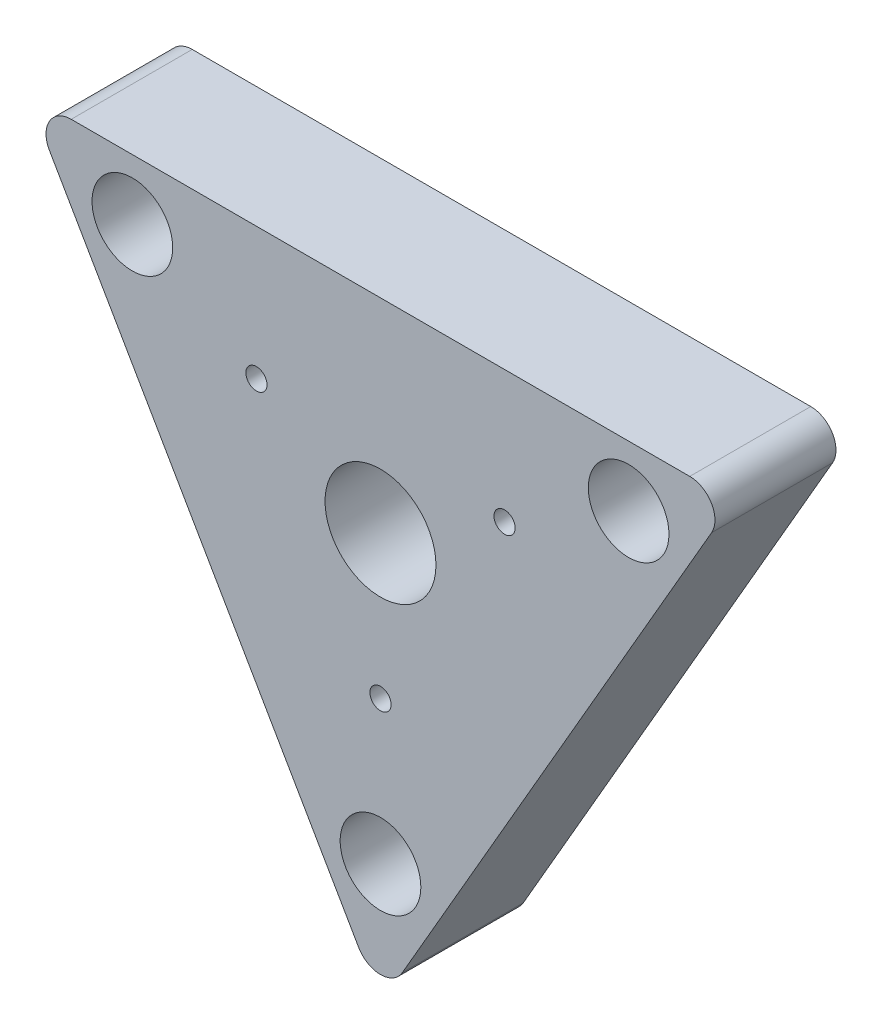
ISO-10303-21;
HEADER;
FILE_DESCRIPTION(('STEP AP214'),'2;1');
FILE_NAME('part.step','',(''),(''),'','','');
FILE_SCHEMA(('AUTOMOTIVE_DESIGN { 1 0 10303 214 1 1 1 1 }'));
ENDSEC;
DATA;
#1=APPLICATION_CONTEXT('core data for automotive mechanical design processes');
#2=APPLICATION_PROTOCOL_DEFINITION('international standard','automotive_design',2000,#1);
#3=PRODUCT_CONTEXT('',#1,'mechanical');
#4=PRODUCT('Part','Part','',(#3));
#5=PRODUCT_RELATED_PRODUCT_CATEGORY('part','',(#4));
#6=PRODUCT_DEFINITION_FORMATION('','',#4);
#7=PRODUCT_DEFINITION_CONTEXT('part definition',#1,'design');
#8=PRODUCT_DEFINITION('design','',#6,#7);
#9=PRODUCT_DEFINITION_SHAPE('','',#8);
#10=(LENGTH_UNIT() NAMED_UNIT(*) SI_UNIT(.MILLI.,.METRE.));
#11=(NAMED_UNIT(*) PLANE_ANGLE_UNIT() SI_UNIT($,.RADIAN.));
#12=(NAMED_UNIT(*) SI_UNIT($,.STERADIAN.) SOLID_ANGLE_UNIT());
#13=UNCERTAINTY_MEASURE_WITH_UNIT(LENGTH_MEASURE(1.E-05),#10,'distance_accuracy_value','');
#14=(GEOMETRIC_REPRESENTATION_CONTEXT(3) GLOBAL_UNCERTAINTY_ASSIGNED_CONTEXT((#13)) GLOBAL_UNIT_ASSIGNED_CONTEXT((#10,
#11,#12)) REPRESENTATION_CONTEXT('',''));
#15=CARTESIAN_POINT('',(0.,0.,0.));
#16=DIRECTION('',(0.,0.,1.));
#17=DIRECTION('',(1.,0.,0.));
#18=AXIS2_PLACEMENT_3D('',#15,#16,#17);
#19=CARTESIAN_POINT('',(43.123778273753,-24.897524994825,24.));
#20=DIRECTION('',(0.866025403784438,-0.5,0.));
#21=DIRECTION('',(0.5,0.866025403784439,0.));
#22=AXIS2_PLACEMENT_3D('',#19,#20,#21);
#23=PLANE('',#22);
#24=DIRECTION('',(-0.5,-0.866025403784439,0.));
#25=VECTOR('',#24,1.);
#26=CARTESIAN_POINT('',(43.123778273753,-24.897524994825,0.));
#27=LINE('',#26,#25);
#28=CARTESIAN_POINT('',(74.0551568549426,28.6771942559431,0.));
#29=VERTEX_POINT('',#28);
#30=CARTESIAN_POINT('',(12.7154108927871,-77.5663622738782,0.));
#31=VERTEX_POINT('',#30);
#32=EDGE_CURVE('E130',#29,#31,#27,.T.);
#33=ORIENTED_EDGE('',*,*,#32,.F.);
#34=DIRECTION('',(0.,0.,-1.));
#35=VECTOR('',#34,1.);
#36=CARTESIAN_POINT('',(74.0551568549426,28.6771942559431,24.));
#37=LINE('',#36,#35);
#38=CARTESIAN_POINT('',(74.0551568549426,28.6771942559431,24.));
#39=VERTEX_POINT('',#38);
#40=EDGE_CURVE('E11',#39,#29,#37,.T.);
#41=ORIENTED_EDGE('',*,*,#40,.F.);
#42=DIRECTION('',(-0.5,-0.866025403784439,0.));
#43=VECTOR('',#42,1.);
#44=CARTESIAN_POINT('',(43.123778273753,-24.897524994825,24.));
#45=LINE('',#44,#43);
#46=CARTESIAN_POINT('',(12.7154108927871,-77.5663622738782,24.));
#47=VERTEX_POINT('',#46);
#48=EDGE_CURVE('E245',#39,#47,#45,.T.);
#49=ORIENTED_EDGE('',*,*,#48,.T.);
#50=DIRECTION('',(0.,0.,-1.));
#51=VECTOR('',#50,1.);
#52=CARTESIAN_POINT('',(12.7154108927871,-77.5663622738782,24.));
#53=LINE('',#52,#51);
#54=EDGE_CURVE('E52',#47,#31,#53,.T.);
#55=ORIENTED_EDGE('',*,*,#54,.T.);
#56=EDGE_LOOP('',(#33,#41,#49,#55));
#57=FACE_BOUND('',#56,.T.);
#58=ADVANCED_FACE('F35',(#57),#23,.T.);
#59=CARTESIAN_POINT('',(69.7250298360205,31.1771942559432,24.));
#60=DIRECTION('',(0.,0.,-1.));
#61=DIRECTION('',(-1.,0.,0.));
#62=AXIS2_PLACEMENT_3D('',#59,#60,#61);
#63=CYLINDRICAL_SURFACE('',#62,5.);
#64=CARTESIAN_POINT('',(69.7250298360205,31.1771942559432,0.));
#65=DIRECTION('',(0.,0.,1.));
#66=DIRECTION('',(1.,0.,0.));
#67=AXIS2_PLACEMENT_3D('',#64,#65,#66);
#68=CIRCLE('',#67,5.);
#69=CARTESIAN_POINT('',(69.7250298360204,36.1771942559432,0.));
#70=VERTEX_POINT('',#69);
#71=EDGE_CURVE('E133',#70,#29,#68,.F.);
#72=ORIENTED_EDGE('',*,*,#71,.F.);
#73=DIRECTION('',(0.,0.,-1.));
#74=VECTOR('',#73,1.);
#75=CARTESIAN_POINT('',(69.7250298360204,36.1771942559432,24.));
#76=LINE('',#75,#74);
#77=CARTESIAN_POINT('',(69.7250298360204,36.1771942559432,24.));
#78=VERTEX_POINT('',#77);
#79=EDGE_CURVE('E44',#78,#70,#76,.T.);
#80=ORIENTED_EDGE('',*,*,#79,.F.);
#81=CARTESIAN_POINT('',(69.7250298360205,31.1771942559432,24.));
#82=DIRECTION('',(0.,0.,1.));
#83=DIRECTION('',(1.,0.,0.));
#84=AXIS2_PLACEMENT_3D('',#81,#82,#83);
#85=CIRCLE('',#84,5.);
#86=EDGE_CURVE('E247',#78,#39,#85,.F.);
#87=ORIENTED_EDGE('',*,*,#86,.T.);
#88=ORIENTED_EDGE('',*,*,#40,.T.);
#89=EDGE_LOOP('',(#72,#80,#87,#88));
#90=FACE_BOUND('',#89,.T.);
#91=ADVANCED_FACE('F163',(#90),#63,.T.);
#92=CARTESIAN_POINT('',(0.,36.1771942559432,24.));
#93=DIRECTION('',(0.,1.,0.));
#94=DIRECTION('',(0.,0.,1.));
#95=AXIS2_PLACEMENT_3D('',#92,#93,#94);
#96=PLANE('',#95);
#97=DIRECTION('',(1.,0.,0.));
#98=VECTOR('',#97,1.);
#99=CARTESIAN_POINT('',(0.,36.1771942559432,0.));
#100=LINE('',#99,#98);
#101=CARTESIAN_POINT('',(-52.9544620882907,36.1771942559432,0.));
#102=VERTEX_POINT('',#101);
#103=EDGE_CURVE('E136',#102,#70,#100,.T.);
#104=ORIENTED_EDGE('',*,*,#103,.F.);
#105=DIRECTION('',(0.,0.,-1.));
#106=VECTOR('',#105,1.);
#107=CARTESIAN_POINT('',(-52.9544620882907,36.1771942559432,24.));
#108=LINE('',#107,#106);
#109=CARTESIAN_POINT('',(-52.9544620882907,36.1771942559432,24.));
#110=VERTEX_POINT('',#109);
#111=EDGE_CURVE('E110',#110,#102,#108,.T.);
#112=ORIENTED_EDGE('',*,*,#111,.F.);
#113=DIRECTION('',(1.,0.,0.));
#114=VECTOR('',#113,1.);
#115=CARTESIAN_POINT('',(0.,36.1771942559432,24.));
#116=LINE('',#115,#114);
#117=EDGE_CURVE('E100',#110,#78,#116,.T.);
#118=ORIENTED_EDGE('',*,*,#117,.T.);
#119=ORIENTED_EDGE('',*,*,#79,.T.);
#120=EDGE_LOOP('',(#104,#112,#118,#119));
#121=FACE_BOUND('',#120,.T.);
#122=ADVANCED_FACE('F160',(#121),#96,.T.);
#123=CARTESIAN_POINT('',(-52.9544620882908,31.1771942559432,24.));
#124=DIRECTION('',(0.,0.,-1.));
#125=DIRECTION('',(-1.,0.,0.));
#126=AXIS2_PLACEMENT_3D('',#123,#124,#125);
#127=CYLINDRICAL_SURFACE('',#126,5.);
#128=CARTESIAN_POINT('',(-52.9544620882908,31.1771942559432,0.));
#129=DIRECTION('',(0.,0.,1.));
#130=DIRECTION('',(1.,0.,0.));
#131=AXIS2_PLACEMENT_3D('',#128,#129,#130);
#132=CIRCLE('',#131,5.);
#133=CARTESIAN_POINT('',(-57.2845891072129,28.6771942559431,0.));
#134=VERTEX_POINT('',#133);
#135=EDGE_CURVE('E107',#102,#134,#132,.T.);
#136=ORIENTED_EDGE('',*,*,#135,.T.);
#137=DIRECTION('',(0.,0.,-1.));
#138=VECTOR('',#137,1.);
#139=CARTESIAN_POINT('',(-57.2845891072129,28.6771942559431,24.));
#140=LINE('',#139,#138);
#141=CARTESIAN_POINT('',(-57.2845891072129,28.6771942559431,24.));
#142=VERTEX_POINT('',#141);
#143=EDGE_CURVE('E104',#142,#134,#140,.T.);
#144=ORIENTED_EDGE('',*,*,#143,.F.);
#145=CARTESIAN_POINT('',(-52.9544620882908,31.1771942559432,24.));
#146=DIRECTION('',(0.,0.,1.));
#147=DIRECTION('',(1.,0.,0.));
#148=AXIS2_PLACEMENT_3D('',#145,#146,#147);
#149=CIRCLE('',#148,5.);
#150=EDGE_CURVE('E91',#110,#142,#149,.T.);
#151=ORIENTED_EDGE('',*,*,#150,.F.);
#152=ORIENTED_EDGE('',*,*,#111,.T.);
#153=EDGE_LOOP('',(#136,#144,#151,#152));
#154=FACE_BOUND('',#153,.T.);
#155=ADVANCED_FACE('F105',(#154),#127,.T.);
#156=CARTESIAN_POINT('',(-30.5458524629557,-17.6356561421141,24.));
#157=DIRECTION('',(-0.866025403784439,-0.5,0.));
#158=DIRECTION('',(0.5,-0.866025403784439,0.));
#159=AXIS2_PLACEMENT_3D('',#156,#157,#158);
#160=PLANE('',#159);
#161=DIRECTION('',(-0.5,0.866025403784439,0.));
#162=VECTOR('',#161,1.);
#163=CARTESIAN_POINT('',(-30.5458524629557,-17.6356561421141,0.));
#164=LINE('',#163,#162);
#165=CARTESIAN_POINT('',(4.05515685494263,-77.5663622738782,0.));
#166=VERTEX_POINT('',#165);
#167=EDGE_CURVE('E140',#166,#134,#164,.T.);
#168=ORIENTED_EDGE('',*,*,#167,.F.);
#169=DIRECTION('',(0.,0.,-1.));
#170=VECTOR('',#169,1.);
#171=CARTESIAN_POINT('',(4.05515685494263,-77.5663622738782,24.));
#172=LINE('',#171,#170);
#173=CARTESIAN_POINT('',(4.05515685494263,-77.5663622738782,24.));
#174=VERTEX_POINT('',#173);
#175=EDGE_CURVE('E71',#174,#166,#172,.T.);
#176=ORIENTED_EDGE('',*,*,#175,.F.);
#177=DIRECTION('',(-0.5,0.866025403784439,0.));
#178=VECTOR('',#177,1.);
#179=CARTESIAN_POINT('',(-30.5458524629557,-17.6356561421141,24.));
#180=LINE('',#179,#178);
#181=EDGE_CURVE('E97',#174,#142,#180,.T.);
#182=ORIENTED_EDGE('',*,*,#181,.T.);
#183=ORIENTED_EDGE('',*,*,#143,.T.);
#184=EDGE_LOOP('',(#168,#176,#182,#183));
#185=FACE_BOUND('',#184,.T.);
#186=ADVANCED_FACE('F112',(#185),#160,.T.);
#187=CARTESIAN_POINT('',(8.38528387386486,-61.0663622738782,24.));
#188=DIRECTION('',(0.,0.,-1.));
#189=DIRECTION('',(-1.,0.,0.));
#190=AXIS2_PLACEMENT_3D('',#187,#188,#189);
#191=CYLINDRICAL_SURFACE('',#190,8.);
#192=CARTESIAN_POINT('',(8.38528387386486,-61.0663622738782,24.));
#193=DIRECTION('',(0.,0.,1.));
#194=DIRECTION('',(1.,0.,0.));
#195=AXIS2_PLACEMENT_3D('',#192,#193,#194);
#196=CIRCLE('',#195,8.);
#197=CARTESIAN_POINT('',(16.3852838738649,-61.0663622738782,24.));
#198=VERTEX_POINT('',#197);
#199=EDGE_CURVE('E121',#198,#198,#196,.T.);
#200=ORIENTED_EDGE('',*,*,#199,.T.);
#201=EDGE_LOOP('',(#200));
#202=FACE_BOUND('',#201,.T.);
#203=CARTESIAN_POINT('',(8.38528387386486,-61.0663622738782,0.));
#204=DIRECTION('',(0.,0.,1.));
#205=DIRECTION('',(1.,0.,0.));
#206=AXIS2_PLACEMENT_3D('',#203,#204,#205);
#207=CIRCLE('',#206,8.);
#208=CARTESIAN_POINT('',(16.3852838738649,-61.0663622738782,0.));
#209=VERTEX_POINT('',#208);
#210=EDGE_CURVE('E148',#209,#209,#207,.T.);
#211=ORIENTED_EDGE('',*,*,#210,.F.);
#212=EDGE_LOOP('',(#211));
#213=FACE_BOUND('',#212,.T.);
#214=ADVANCED_FACE('F177',(#202,#213),#191,.F.);
#215=CARTESIAN_POINT('',(8.38528387386486,-4.23732458733066,24.));
#216=DIRECTION('',(0.,0.,-1.));
#217=DIRECTION('',(-1.,0.,0.));
#218=AXIS2_PLACEMENT_3D('',#215,#216,#217);
#219=CYLINDRICAL_SURFACE('',#218,11.);
#220=CARTESIAN_POINT('',(8.38528387386486,-4.23732458733066,24.));
#221=DIRECTION('',(0.,0.,1.));
#222=DIRECTION('',(1.,0.,0.));
#223=AXIS2_PLACEMENT_3D('',#220,#221,#222);
#224=CIRCLE('',#223,11.);
#225=CARTESIAN_POINT('',(19.3852838738649,-4.23732458733066,24.));
#226=VERTEX_POINT('',#225);
#227=EDGE_CURVE('E115',#226,#226,#224,.T.);
#228=ORIENTED_EDGE('',*,*,#227,.T.);
#229=EDGE_LOOP('',(#228));
#230=FACE_BOUND('',#229,.T.);
#231=CARTESIAN_POINT('',(8.38528387386486,-4.23732458733066,0.));
#232=DIRECTION('',(0.,0.,1.));
#233=DIRECTION('',(1.,0.,0.));
#234=AXIS2_PLACEMENT_3D('',#231,#232,#233);
#235=CIRCLE('',#234,11.);
#236=CARTESIAN_POINT('',(19.3852838738649,-4.23732458733066,0.));
#237=VERTEX_POINT('',#236);
#238=EDGE_CURVE('E145',#237,#237,#235,.T.);
#239=ORIENTED_EDGE('',*,*,#238,.F.);
#240=EDGE_LOOP('',(#239));
#241=FACE_BOUND('',#240,.T.);
#242=ADVANCED_FACE('F169',(#230,#241),#219,.F.);
#243=CARTESIAN_POINT('',(8.38528387386485,-75.0663622738783,24.));
#244=DIRECTION('',(0.,0.,-1.));
#245=DIRECTION('',(-1.,0.,0.));
#246=AXIS2_PLACEMENT_3D('',#243,#244,#245);
#247=CYLINDRICAL_SURFACE('',#246,5.);
#248=CARTESIAN_POINT('',(8.38528387386485,-75.0663622738783,0.));
#249=DIRECTION('',(0.,0.,1.));
#250=DIRECTION('',(1.,0.,0.));
#251=AXIS2_PLACEMENT_3D('',#248,#249,#250);
#252=CIRCLE('',#251,5.);
#253=EDGE_CURVE('E142',#31,#166,#252,.F.);
#254=ORIENTED_EDGE('',*,*,#253,.F.);
#255=ORIENTED_EDGE('',*,*,#54,.F.);
#256=CARTESIAN_POINT('',(8.38528387386485,-75.0663622738783,24.));
#257=DIRECTION('',(0.,0.,1.));
#258=DIRECTION('',(1.,0.,0.));
#259=AXIS2_PLACEMENT_3D('',#256,#257,#258);
#260=CIRCLE('',#259,5.);
#261=EDGE_CURVE('E113',#47,#174,#260,.F.);
#262=ORIENTED_EDGE('',*,*,#261,.T.);
#263=ORIENTED_EDGE('',*,*,#175,.T.);
#264=EDGE_LOOP('',(#254,#255,#262,#263));
#265=FACE_BOUND('',#264,.T.);
#266=ADVANCED_FACE('F167',(#265),#247,.T.);
#267=CARTESIAN_POINT('',(57.6006741830383,24.1771942559432,24.));
#268=DIRECTION('',(0.,0.,-1.));
#269=DIRECTION('',(-1.,0.,0.));
#270=AXIS2_PLACEMENT_3D('',#267,#268,#269);
#271=CYLINDRICAL_SURFACE('',#270,8.00000000000001);
#272=CARTESIAN_POINT('',(57.6006741830383,24.1771942559432,24.));
#273=DIRECTION('',(0.,0.,1.));
#274=DIRECTION('',(1.,0.,0.));
#275=AXIS2_PLACEMENT_3D('',#272,#273,#274);
#276=CIRCLE('',#275,8.00000000000001);
#277=CARTESIAN_POINT('',(65.6006741830383,24.1771942559432,24.));
#278=VERTEX_POINT('',#277);
#279=EDGE_CURVE('E154',#278,#278,#276,.T.);
#280=ORIENTED_EDGE('',*,*,#279,.T.);
#281=EDGE_LOOP('',(#280));
#282=FACE_BOUND('',#281,.T.);
#283=CARTESIAN_POINT('',(57.6006741830383,24.1771942559432,0.));
#284=DIRECTION('',(0.,0.,1.));
#285=DIRECTION('',(1.,0.,0.));
#286=AXIS2_PLACEMENT_3D('',#283,#284,#285);
#287=CIRCLE('',#286,8.00000000000001);
#288=CARTESIAN_POINT('',(65.6006741830383,24.1771942559432,0.));
#289=VERTEX_POINT('',#288);
#290=EDGE_CURVE('E127',#289,#289,#287,.T.);
#291=ORIENTED_EDGE('',*,*,#290,.F.);
#292=EDGE_LOOP('',(#291));
#293=FACE_BOUND('',#292,.T.);
#294=ADVANCED_FACE('F37',(#282,#293),#271,.F.);
#295=CARTESIAN_POINT('',(-40.8301064353086,24.1771942559432,24.));
#296=DIRECTION('',(0.,0.,-1.));
#297=DIRECTION('',(-1.,0.,0.));
#298=AXIS2_PLACEMENT_3D('',#295,#296,#297);
#299=CYLINDRICAL_SURFACE('',#298,8.);
#300=CARTESIAN_POINT('',(-40.8301064353086,24.1771942559432,24.));
#301=DIRECTION('',(0.,0.,1.));
#302=DIRECTION('',(1.,0.,0.));
#303=AXIS2_PLACEMENT_3D('',#300,#301,#302);
#304=CIRCLE('',#303,8.);
#305=CARTESIAN_POINT('',(-32.8301064353086,24.1771942559432,24.));
#306=VERTEX_POINT('',#305);
#307=EDGE_CURVE('E124',#306,#306,#304,.T.);
#308=ORIENTED_EDGE('',*,*,#307,.T.);
#309=EDGE_LOOP('',(#308));
#310=FACE_BOUND('',#309,.T.);
#311=CARTESIAN_POINT('',(-40.8301064353086,24.1771942559432,0.));
#312=DIRECTION('',(0.,0.,1.));
#313=DIRECTION('',(1.,0.,0.));
#314=AXIS2_PLACEMENT_3D('',#311,#312,#313);
#315=CIRCLE('',#314,8.);
#316=CARTESIAN_POINT('',(-32.8301064353086,24.1771942559432,0.));
#317=VERTEX_POINT('',#316);
#318=EDGE_CURVE('E151',#317,#317,#315,.T.);
#319=ORIENTED_EDGE('',*,*,#318,.F.);
#320=EDGE_LOOP('',(#319));
#321=FACE_BOUND('',#320,.T.);
#322=ADVANCED_FACE('F175',(#310,#321),#299,.F.);
#323=CARTESIAN_POINT('',(0.,0.,24.));
#324=DIRECTION('',(0.,0.,1.));
#325=DIRECTION('',(1.,0.,0.));
#326=AXIS2_PLACEMENT_3D('',#323,#324,#325);
#327=PLANE('',#326);
#328=CARTESIAN_POINT('',(-16.2224112807219,9.96993483430625,24.));
#329=DIRECTION('',(0.,0.,1.));
#330=DIRECTION('',(1.,0.,0.));
#331=AXIS2_PLACEMENT_3D('',#328,#329,#330);
#332=CIRCLE('',#331,2.09999999999999);
#333=CARTESIAN_POINT('',(-14.1224112807219,9.96993483430625,24.));
#334=VERTEX_POINT('',#333);
#335=EDGE_CURVE('E228',#334,#334,#332,.T.);
#336=ORIENTED_EDGE('',*,*,#335,.F.);
#337=EDGE_LOOP('',(#336));
#338=FACE_BOUND('',#337,.T.);
#339=CARTESIAN_POINT('',(32.9929790284516,9.96993483430625,24.));
#340=DIRECTION('',(0.,0.,1.));
#341=DIRECTION('',(1.,0.,0.));
#342=AXIS2_PLACEMENT_3D('',#339,#340,#341);
#343=CIRCLE('',#342,2.09999999999999);
#344=CARTESIAN_POINT('',(35.0929790284516,9.96993483430625,24.));
#345=VERTEX_POINT('',#344);
#346=EDGE_CURVE('E230',#345,#345,#343,.T.);
#347=ORIENTED_EDGE('',*,*,#346,.F.);
#348=EDGE_LOOP('',(#347));
#349=FACE_BOUND('',#348,.T.);
#350=CARTESIAN_POINT('',(8.38528387386486,-32.6518434306044,24.));
#351=DIRECTION('',(0.,0.,1.));
#352=DIRECTION('',(1.,0.,0.));
#353=AXIS2_PLACEMENT_3D('',#350,#351,#352);
#354=CIRCLE('',#353,2.09999999999999);
#355=CARTESIAN_POINT('',(10.4852838738648,-32.6518434306044,24.));
#356=VERTEX_POINT('',#355);
#357=EDGE_CURVE('E238',#356,#356,#354,.T.);
#358=ORIENTED_EDGE('',*,*,#357,.F.);
#359=EDGE_LOOP('',(#358));
#360=FACE_BOUND('',#359,.T.);
#361=ORIENTED_EDGE('',*,*,#279,.F.);
#362=EDGE_LOOP('',(#361));
#363=FACE_BOUND('',#362,.T.);
#364=ORIENTED_EDGE('',*,*,#48,.F.);
#365=ORIENTED_EDGE('',*,*,#86,.F.);
#366=ORIENTED_EDGE('',*,*,#117,.F.);
#367=ORIENTED_EDGE('',*,*,#150,.T.);
#368=ORIENTED_EDGE('',*,*,#181,.F.);
#369=ORIENTED_EDGE('',*,*,#261,.F.);
#370=EDGE_LOOP('',(#364,#365,#366,#367,#368,#369));
#371=FACE_BOUND('',#370,.T.);
#372=ORIENTED_EDGE('',*,*,#227,.F.);
#373=EDGE_LOOP('',(#372));
#374=FACE_BOUND('',#373,.T.);
#375=ORIENTED_EDGE('',*,*,#199,.F.);
#376=EDGE_LOOP('',(#375));
#377=FACE_BOUND('',#376,.T.);
#378=ORIENTED_EDGE('',*,*,#307,.F.);
#379=EDGE_LOOP('',(#378));
#380=FACE_BOUND('',#379,.T.);
#381=ADVANCED_FACE('F93',(#338,#349,#360,#363,#371,#374,#377,#380),#327,.T.);
#382=CARTESIAN_POINT('',(0.,0.,0.));
#383=DIRECTION('',(0.,0.,1.));
#384=DIRECTION('',(1.,0.,0.));
#385=AXIS2_PLACEMENT_3D('',#382,#383,#384);
#386=PLANE('',#385);
#387=CARTESIAN_POINT('',(-16.2224112807219,9.96993483430625,0.));
#388=DIRECTION('',(0.,0.,1.));
#389=DIRECTION('',(1.,0.,0.));
#390=AXIS2_PLACEMENT_3D('',#387,#388,#389);
#391=CIRCLE('',#390,2.09999999999999);
#392=CARTESIAN_POINT('',(-14.1224112807219,9.96993483430625,0.));
#393=VERTEX_POINT('',#392);
#394=EDGE_CURVE('E225',#393,#393,#391,.T.);
#395=ORIENTED_EDGE('',*,*,#394,.T.);
#396=EDGE_LOOP('',(#395));
#397=FACE_BOUND('',#396,.T.);
#398=CARTESIAN_POINT('',(32.9929790284516,9.96993483430625,0.));
#399=DIRECTION('',(0.,0.,1.));
#400=DIRECTION('',(1.,0.,0.));
#401=AXIS2_PLACEMENT_3D('',#398,#399,#400);
#402=CIRCLE('',#401,2.09999999999999);
#403=CARTESIAN_POINT('',(35.0929790284516,9.96993483430625,0.));
#404=VERTEX_POINT('',#403);
#405=EDGE_CURVE('E235',#404,#404,#402,.T.);
#406=ORIENTED_EDGE('',*,*,#405,.T.);
#407=EDGE_LOOP('',(#406));
#408=FACE_BOUND('',#407,.T.);
#409=CARTESIAN_POINT('',(8.38528387386486,-32.6518434306044,0.));
#410=DIRECTION('',(0.,0.,1.));
#411=DIRECTION('',(1.,0.,0.));
#412=AXIS2_PLACEMENT_3D('',#409,#410,#411);
#413=CIRCLE('',#412,2.09999999999999);
#414=CARTESIAN_POINT('',(10.4852838738648,-32.6518434306044,0.));
#415=VERTEX_POINT('',#414);
#416=EDGE_CURVE('E131',#415,#415,#413,.T.);
#417=ORIENTED_EDGE('',*,*,#416,.T.);
#418=EDGE_LOOP('',(#417));
#419=FACE_BOUND('',#418,.T.);
#420=ORIENTED_EDGE('',*,*,#290,.T.);
#421=EDGE_LOOP('',(#420));
#422=FACE_BOUND('',#421,.T.);
#423=ORIENTED_EDGE('',*,*,#32,.T.);
#424=ORIENTED_EDGE('',*,*,#253,.T.);
#425=ORIENTED_EDGE('',*,*,#167,.T.);
#426=ORIENTED_EDGE('',*,*,#135,.F.);
#427=ORIENTED_EDGE('',*,*,#103,.T.);
#428=ORIENTED_EDGE('',*,*,#71,.T.);
#429=EDGE_LOOP('',(#423,#424,#425,#426,#427,#428));
#430=FACE_BOUND('',#429,.T.);
#431=ORIENTED_EDGE('',*,*,#238,.T.);
#432=EDGE_LOOP('',(#431));
#433=FACE_BOUND('',#432,.T.);
#434=ORIENTED_EDGE('',*,*,#210,.T.);
#435=EDGE_LOOP('',(#434));
#436=FACE_BOUND('',#435,.T.);
#437=ORIENTED_EDGE('',*,*,#318,.T.);
#438=EDGE_LOOP('',(#437));
#439=FACE_BOUND('',#438,.T.);
#440=ADVANCED_FACE('F165',(#397,#408,#419,#422,#430,#433,#436,#439),#386,.F.);
#441=CARTESIAN_POINT('',(8.38528387386486,-32.6518434306044,24.));
#442=DIRECTION('',(0.,0.,1.));
#443=DIRECTION('',(1.,0.,0.));
#444=AXIS2_PLACEMENT_3D('',#441,#442,#443);
#445=CYLINDRICAL_SURFACE('',#444,2.09999999999999);
#446=ORIENTED_EDGE('',*,*,#416,.F.);
#447=EDGE_LOOP('',(#446));
#448=FACE_BOUND('',#447,.T.);
#449=ORIENTED_EDGE('',*,*,#357,.T.);
#450=EDGE_LOOP('',(#449));
#451=FACE_BOUND('',#450,.T.);
#452=ADVANCED_FACE('F205',(#448,#451),#445,.F.);
#453=CARTESIAN_POINT('',(32.9929790284516,9.96993483430625,24.));
#454=DIRECTION('',(0.,0.,1.));
#455=DIRECTION('',(1.,0.,0.));
#456=AXIS2_PLACEMENT_3D('',#453,#454,#455);
#457=CYLINDRICAL_SURFACE('',#456,2.09999999999999);
#458=ORIENTED_EDGE('',*,*,#405,.F.);
#459=EDGE_LOOP('',(#458));
#460=FACE_BOUND('',#459,.T.);
#461=ORIENTED_EDGE('',*,*,#346,.T.);
#462=EDGE_LOOP('',(#461));
#463=FACE_BOUND('',#462,.T.);
#464=ADVANCED_FACE('F212',(#460,#463),#457,.F.);
#465=CARTESIAN_POINT('',(-16.2224112807219,9.96993483430625,24.));
#466=DIRECTION('',(0.,0.,1.));
#467=DIRECTION('',(1.,0.,0.));
#468=AXIS2_PLACEMENT_3D('',#465,#466,#467);
#469=CYLINDRICAL_SURFACE('',#468,2.09999999999999);
#470=ORIENTED_EDGE('',*,*,#394,.F.);
#471=EDGE_LOOP('',(#470));
#472=FACE_BOUND('',#471,.T.);
#473=ORIENTED_EDGE('',*,*,#335,.T.);
#474=EDGE_LOOP('',(#473));
#475=FACE_BOUND('',#474,.T.);
#476=ADVANCED_FACE('F216',(#472,#475),#469,.F.);
#477=CLOSED_SHELL('',(#58,#91,#122,#155,#186,#214,#242,#266,#294,#322,#381,#440,#452,#464,#476));
#478=MANIFOLD_SOLID_BREP('B2',#477);
#479=ADVANCED_BREP_SHAPE_REPRESENTATION('',(#18,#478),#14);
#480=SHAPE_DEFINITION_REPRESENTATION(#9,#479);
ENDSEC;
END-ISO-10303-21;
